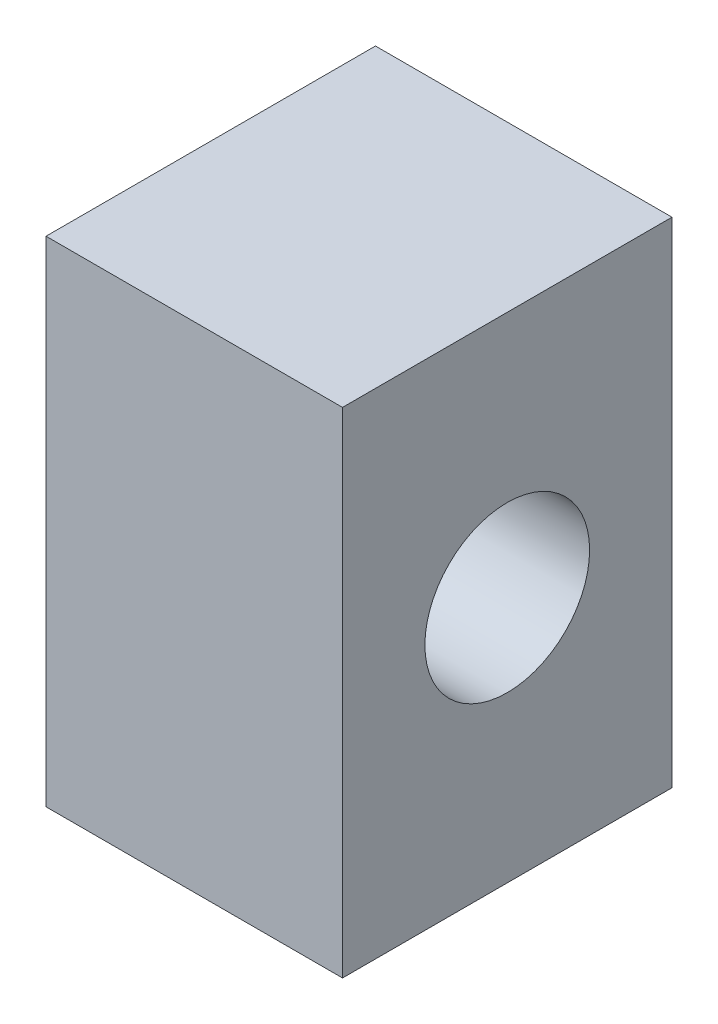
ISO-10303-21;
HEADER;
FILE_DESCRIPTION(('STEP AP214'),'2;1');
FILE_NAME('part.step','',(''),(''),'','','');
FILE_SCHEMA(('AUTOMOTIVE_DESIGN { 1 0 10303 214 1 1 1 1 }'));
ENDSEC;
DATA;
#1=APPLICATION_CONTEXT('core data for automotive mechanical design processes');
#2=APPLICATION_PROTOCOL_DEFINITION('international standard','automotive_design',2000,#1);
#3=PRODUCT_CONTEXT('',#1,'mechanical');
#4=PRODUCT('Part','Part','',(#3));
#5=PRODUCT_RELATED_PRODUCT_CATEGORY('part','',(#4));
#6=PRODUCT_DEFINITION_FORMATION('','',#4);
#7=PRODUCT_DEFINITION_CONTEXT('part definition',#1,'design');
#8=PRODUCT_DEFINITION('design','',#6,#7);
#9=PRODUCT_DEFINITION_SHAPE('','',#8);
#10=(LENGTH_UNIT() NAMED_UNIT(*) SI_UNIT(.MILLI.,.METRE.));
#11=(NAMED_UNIT(*) PLANE_ANGLE_UNIT() SI_UNIT($,.RADIAN.));
#12=(NAMED_UNIT(*) SI_UNIT($,.STERADIAN.) SOLID_ANGLE_UNIT());
#13=UNCERTAINTY_MEASURE_WITH_UNIT(LENGTH_MEASURE(1.E-05),#10,'distance_accuracy_value','');
#14=(GEOMETRIC_REPRESENTATION_CONTEXT(3) GLOBAL_UNCERTAINTY_ASSIGNED_CONTEXT((#13)) GLOBAL_UNIT_ASSIGNED_CONTEXT((#10,
#11,#12)) REPRESENTATION_CONTEXT('',''));
#15=CARTESIAN_POINT('',(0.,0.,0.));
#16=DIRECTION('',(0.,0.,1.));
#17=DIRECTION('',(1.,0.,0.));
#18=AXIS2_PLACEMENT_3D('',#15,#16,#17);
#19=CARTESIAN_POINT('',(11.43,38.1,12.7));
#20=DIRECTION('',(-1.,0.,0.));
#21=DIRECTION('',(0.,0.,1.));
#22=AXIS2_PLACEMENT_3D('',#19,#20,#21);
#23=PLANE('',#22);
#24=CARTESIAN_POINT('',(11.43,19.05,0.));
#25=DIRECTION('',(1.,0.,0.));
#26=DIRECTION('',(0.,0.,-1.));
#27=AXIS2_PLACEMENT_3D('',#24,#25,#26);
#28=CIRCLE('',#27,6.35);
#29=CARTESIAN_POINT('',(11.43,19.05,-6.35));
#30=VERTEX_POINT('',#29);
#31=EDGE_CURVE('E110',#30,#30,#28,.T.);
#32=ORIENTED_EDGE('',*,*,#31,.F.);
#33=EDGE_LOOP('',(#32));
#34=FACE_BOUND('',#33,.T.);
#35=DIRECTION('',(0.,0.,-1.));
#36=VECTOR('',#35,1.);
#37=CARTESIAN_POINT('',(11.43,0.,12.7));
#38=LINE('',#37,#36);
#39=CARTESIAN_POINT('',(11.43,0.,12.7));
#40=VERTEX_POINT('',#39);
#41=CARTESIAN_POINT('',(11.43,0.,-12.7));
#42=VERTEX_POINT('',#41);
#43=EDGE_CURVE('E96',#40,#42,#38,.T.);
#44=ORIENTED_EDGE('',*,*,#43,.T.);
#45=DIRECTION('',(0.,-1.,0.));
#46=VECTOR('',#45,1.);
#47=CARTESIAN_POINT('',(11.43,38.1,-12.7));
#48=LINE('',#47,#46);
#49=CARTESIAN_POINT('',(11.43,38.1,-12.7));
#50=VERTEX_POINT('',#49);
#51=EDGE_CURVE('E11',#50,#42,#48,.T.);
#52=ORIENTED_EDGE('',*,*,#51,.F.);
#53=DIRECTION('',(0.,0.,-1.));
#54=VECTOR('',#53,1.);
#55=CARTESIAN_POINT('',(11.43,38.1,12.7));
#56=LINE('',#55,#54);
#57=CARTESIAN_POINT('',(11.43,38.1,12.7));
#58=VERTEX_POINT('',#57);
#59=EDGE_CURVE('E84',#58,#50,#56,.T.);
#60=ORIENTED_EDGE('',*,*,#59,.F.);
#61=DIRECTION('',(0.,-1.,0.));
#62=VECTOR('',#61,1.);
#63=CARTESIAN_POINT('',(11.43,38.1,12.7));
#64=LINE('',#63,#62);
#65=EDGE_CURVE('E92',#58,#40,#64,.T.);
#66=ORIENTED_EDGE('',*,*,#65,.T.);
#67=EDGE_LOOP('',(#44,#52,#60,#66));
#68=FACE_BOUND('',#67,.T.);
#69=ADVANCED_FACE('F33',(#34,#68),#23,.F.);
#70=CARTESIAN_POINT('',(-11.43,38.1,-12.7));
#71=DIRECTION('',(0.,0.,1.));
#72=DIRECTION('',(1.,0.,0.));
#73=AXIS2_PLACEMENT_3D('',#70,#71,#72);
#74=PLANE('',#73);
#75=DIRECTION('',(-1.,0.,0.));
#76=VECTOR('',#75,1.);
#77=CARTESIAN_POINT('',(-11.43,0.,-12.7));
#78=LINE('',#77,#76);
#79=CARTESIAN_POINT('',(-11.43,0.,-12.7));
#80=VERTEX_POINT('',#79);
#81=EDGE_CURVE('E88',#42,#80,#78,.T.);
#82=ORIENTED_EDGE('',*,*,#81,.T.);
#83=DIRECTION('',(0.,-1.,0.));
#84=VECTOR('',#83,1.);
#85=CARTESIAN_POINT('',(-11.43,38.1,-12.7));
#86=LINE('',#85,#84);
#87=CARTESIAN_POINT('',(-11.43,38.1,-12.7));
#88=VERTEX_POINT('',#87);
#89=EDGE_CURVE('E41',#88,#80,#86,.T.);
#90=ORIENTED_EDGE('',*,*,#89,.F.);
#91=DIRECTION('',(-1.,0.,0.));
#92=VECTOR('',#91,1.);
#93=CARTESIAN_POINT('',(-11.43,38.1,-12.7));
#94=LINE('',#93,#92);
#95=EDGE_CURVE('E79',#50,#88,#94,.T.);
#96=ORIENTED_EDGE('',*,*,#95,.F.);
#97=ORIENTED_EDGE('',*,*,#51,.T.);
#98=EDGE_LOOP('',(#82,#90,#96,#97));
#99=FACE_BOUND('',#98,.T.);
#100=ADVANCED_FACE('F87',(#99),#74,.F.);
#101=CARTESIAN_POINT('',(-11.43,38.1,12.7));
#102=DIRECTION('',(1.,0.,0.));
#103=DIRECTION('',(0.,0.,-1.));
#104=AXIS2_PLACEMENT_3D('',#101,#102,#103);
#105=PLANE('',#104);
#106=CARTESIAN_POINT('',(-11.43,19.05,0.));
#107=DIRECTION('',(1.,0.,0.));
#108=DIRECTION('',(0.,0.,-1.));
#109=AXIS2_PLACEMENT_3D('',#106,#107,#108);
#110=CIRCLE('',#109,6.35);
#111=CARTESIAN_POINT('',(-11.43,19.05,-6.35));
#112=VERTEX_POINT('',#111);
#113=EDGE_CURVE('E99',#112,#112,#110,.T.);
#114=ORIENTED_EDGE('',*,*,#113,.T.);
#115=EDGE_LOOP('',(#114));
#116=FACE_BOUND('',#115,.T.);
#117=DIRECTION('',(0.,0.,1.));
#118=VECTOR('',#117,1.);
#119=CARTESIAN_POINT('',(-11.43,0.,12.7));
#120=LINE('',#119,#118);
#121=CARTESIAN_POINT('',(-11.43,0.,12.7));
#122=VERTEX_POINT('',#121);
#123=EDGE_CURVE('E66',#80,#122,#120,.T.);
#124=ORIENTED_EDGE('',*,*,#123,.T.);
#125=DIRECTION('',(0.,-1.,0.));
#126=VECTOR('',#125,1.);
#127=CARTESIAN_POINT('',(-11.43,38.1,12.7));
#128=LINE('',#127,#126);
#129=CARTESIAN_POINT('',(-11.43,38.1,12.7));
#130=VERTEX_POINT('',#129);
#131=EDGE_CURVE('E89',#130,#122,#128,.T.);
#132=ORIENTED_EDGE('',*,*,#131,.F.);
#133=DIRECTION('',(0.,0.,1.));
#134=VECTOR('',#133,1.);
#135=CARTESIAN_POINT('',(-11.43,38.1,12.7));
#136=LINE('',#135,#134);
#137=EDGE_CURVE('E82',#88,#130,#136,.T.);
#138=ORIENTED_EDGE('',*,*,#137,.F.);
#139=ORIENTED_EDGE('',*,*,#89,.T.);
#140=EDGE_LOOP('',(#124,#132,#138,#139));
#141=FACE_BOUND('',#140,.T.);
#142=ADVANCED_FACE('F90',(#116,#141),#105,.F.);
#143=CARTESIAN_POINT('',(-11.43,38.1,12.7));
#144=DIRECTION('',(0.,0.,-1.));
#145=DIRECTION('',(-1.,0.,0.));
#146=AXIS2_PLACEMENT_3D('',#143,#144,#145);
#147=PLANE('',#146);
#148=DIRECTION('',(1.,0.,0.));
#149=VECTOR('',#148,1.);
#150=CARTESIAN_POINT('',(-11.43,0.,12.7));
#151=LINE('',#150,#149);
#152=EDGE_CURVE('E72',#122,#40,#151,.T.);
#153=ORIENTED_EDGE('',*,*,#152,.T.);
#154=ORIENTED_EDGE('',*,*,#65,.F.);
#155=DIRECTION('',(1.,0.,0.));
#156=VECTOR('',#155,1.);
#157=CARTESIAN_POINT('',(-11.43,38.1,12.7));
#158=LINE('',#157,#156);
#159=EDGE_CURVE('E49',#130,#58,#158,.T.);
#160=ORIENTED_EDGE('',*,*,#159,.F.);
#161=ORIENTED_EDGE('',*,*,#131,.T.);
#162=EDGE_LOOP('',(#153,#154,#160,#161));
#163=FACE_BOUND('',#162,.T.);
#164=ADVANCED_FACE('F104',(#163),#147,.F.);
#165=CARTESIAN_POINT('',(0.,38.1,0.));
#166=DIRECTION('',(0.,-1.,0.));
#167=DIRECTION('',(0.,0.,-1.));
#168=AXIS2_PLACEMENT_3D('',#165,#166,#167);
#169=PLANE('',#168);
#170=ORIENTED_EDGE('',*,*,#59,.T.);
#171=ORIENTED_EDGE('',*,*,#95,.T.);
#172=ORIENTED_EDGE('',*,*,#137,.T.);
#173=ORIENTED_EDGE('',*,*,#159,.T.);
#174=EDGE_LOOP('',(#170,#171,#172,#173));
#175=FACE_BOUND('',#174,.T.);
#176=ADVANCED_FACE('F80',(#175),#169,.F.);
#177=CARTESIAN_POINT('',(0.,0.,0.));
#178=DIRECTION('',(0.,-1.,0.));
#179=DIRECTION('',(0.,0.,-1.));
#180=AXIS2_PLACEMENT_3D('',#177,#178,#179);
#181=PLANE('',#180);
#182=ORIENTED_EDGE('',*,*,#43,.F.);
#183=ORIENTED_EDGE('',*,*,#152,.F.);
#184=ORIENTED_EDGE('',*,*,#123,.F.);
#185=ORIENTED_EDGE('',*,*,#81,.F.);
#186=EDGE_LOOP('',(#182,#183,#184,#185));
#187=FACE_BOUND('',#186,.T.);
#188=ADVANCED_FACE('F107',(#187),#181,.T.);
#189=CARTESIAN_POINT('',(-11.43,19.05,0.));
#190=DIRECTION('',(1.,0.,0.));
#191=DIRECTION('',(0.,0.,-1.));
#192=AXIS2_PLACEMENT_3D('',#189,#190,#191);
#193=CYLINDRICAL_SURFACE('',#192,6.35);
#194=ORIENTED_EDGE('',*,*,#113,.F.);
#195=EDGE_LOOP('',(#194));
#196=FACE_BOUND('',#195,.T.);
#197=ORIENTED_EDGE('',*,*,#31,.T.);
#198=EDGE_LOOP('',(#197));
#199=FACE_BOUND('',#198,.T.);
#200=ADVANCED_FACE('F117',(#196,#199),#193,.F.);
#201=CLOSED_SHELL('',(#69,#100,#142,#164,#176,#188,#200));
#202=MANIFOLD_SOLID_BREP('B2',#201);
#203=ADVANCED_BREP_SHAPE_REPRESENTATION('',(#18,#202),#14);
#204=SHAPE_DEFINITION_REPRESENTATION(#9,#203);
ENDSEC;
END-ISO-10303-21;
